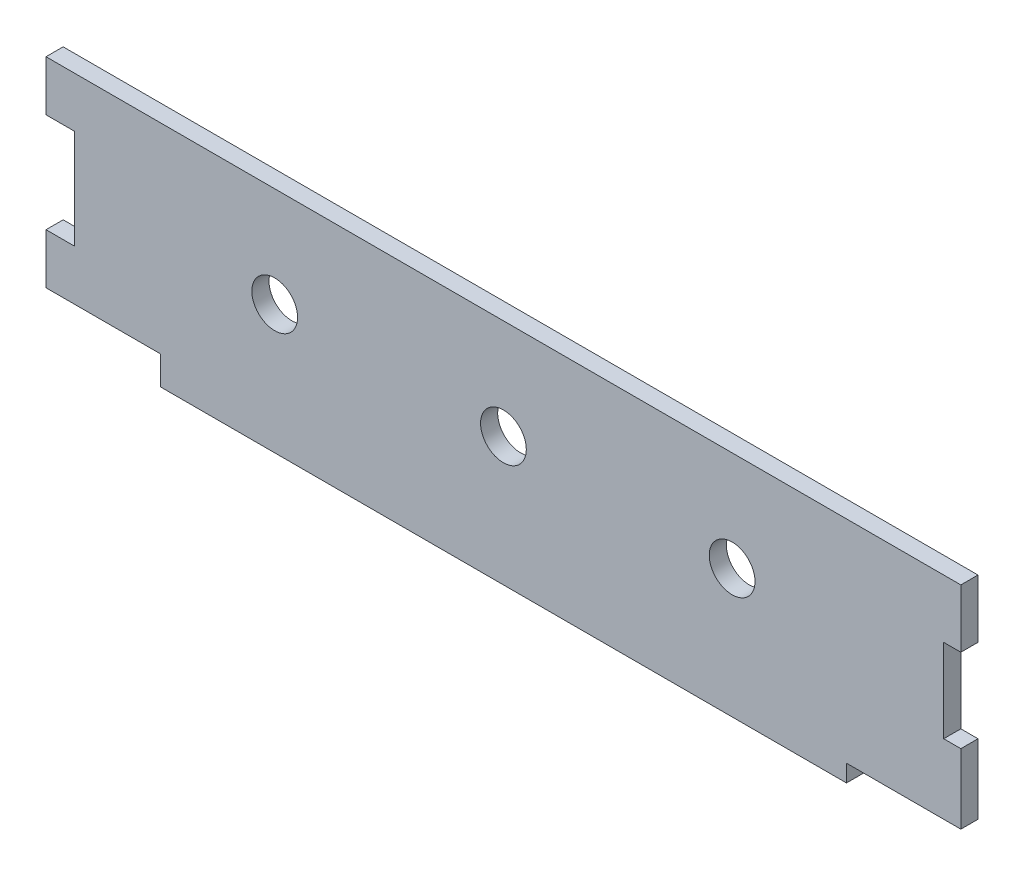
ISO-10303-21;
HEADER;
FILE_DESCRIPTION(('STEP AP214'),'2;1');
FILE_NAME('part.step','',(''),(''),'','','');
FILE_SCHEMA(('AUTOMOTIVE_DESIGN { 1 0 10303 214 1 1 1 1 }'));
ENDSEC;
DATA;
#1=APPLICATION_CONTEXT('core data for automotive mechanical design processes');
#2=APPLICATION_PROTOCOL_DEFINITION('international standard','automotive_design',2000,#1);
#3=PRODUCT_CONTEXT('',#1,'mechanical');
#4=PRODUCT('Part','Part','',(#3));
#5=PRODUCT_RELATED_PRODUCT_CATEGORY('part','',(#4));
#6=PRODUCT_DEFINITION_FORMATION('','',#4);
#7=PRODUCT_DEFINITION_CONTEXT('part definition',#1,'design');
#8=PRODUCT_DEFINITION('design','',#6,#7);
#9=PRODUCT_DEFINITION_SHAPE('','',#8);
#10=(LENGTH_UNIT() NAMED_UNIT(*) SI_UNIT(.MILLI.,.METRE.));
#11=(NAMED_UNIT(*) PLANE_ANGLE_UNIT() SI_UNIT($,.RADIAN.));
#12=(NAMED_UNIT(*) SI_UNIT($,.STERADIAN.) SOLID_ANGLE_UNIT());
#13=UNCERTAINTY_MEASURE_WITH_UNIT(LENGTH_MEASURE(1.E-05),#10,'distance_accuracy_value','');
#14=(GEOMETRIC_REPRESENTATION_CONTEXT(3) GLOBAL_UNCERTAINTY_ASSIGNED_CONTEXT((#13)) GLOBAL_UNIT_ASSIGNED_CONTEXT((#10,
#11,#12)) REPRESENTATION_CONTEXT('',''));
#15=CARTESIAN_POINT('',(0.,0.,0.));
#16=DIRECTION('',(0.,0.,1.));
#17=DIRECTION('',(1.,0.,0.));
#18=AXIS2_PLACEMENT_3D('',#15,#16,#17);
#19=CARTESIAN_POINT('',(0.,0.,1.5));
#20=DIRECTION('',(0.,0.,-1.));
#21=DIRECTION('',(-1.,0.,0.));
#22=AXIS2_PLACEMENT_3D('',#19,#20,#21);
#23=PLANE('',#22);
#24=DIRECTION('',(0.,-1.,0.));
#25=VECTOR('',#24,1.);
#26=CARTESIAN_POINT('',(-40.,4.34999999999999,1.5));
#27=LINE('',#26,#25);
#28=CARTESIAN_POINT('',(-40.0000000000001,8.74999999999999,1.5));
#29=VERTEX_POINT('',#28);
#30=CARTESIAN_POINT('',(-40.,4.34999999999999,1.5));
#31=VERTEX_POINT('',#30);
#32=EDGE_CURVE('E209',#29,#31,#27,.T.);
#33=ORIENTED_EDGE('',*,*,#32,.T.);
#34=DIRECTION('',(1.,0.,0.));
#35=VECTOR('',#34,1.);
#36=CARTESIAN_POINT('',(-37.5,4.34999999999999,1.5));
#37=LINE('',#36,#35);
#38=CARTESIAN_POINT('',(-37.5,4.34999999999999,1.5));
#39=VERTEX_POINT('',#38);
#40=EDGE_CURVE('E117',#31,#39,#37,.T.);
#41=ORIENTED_EDGE('',*,*,#40,.T.);
#42=DIRECTION('',(0.,-1.,0.));
#43=VECTOR('',#42,1.);
#44=CARTESIAN_POINT('',(-37.5,-4.35,1.5));
#45=LINE('',#44,#43);
#46=CARTESIAN_POINT('',(-37.5,-4.35,1.5));
#47=VERTEX_POINT('',#46);
#48=EDGE_CURVE('E248',#39,#47,#45,.T.);
#49=ORIENTED_EDGE('',*,*,#48,.T.);
#50=DIRECTION('',(-1.,0.,0.));
#51=VECTOR('',#50,1.);
#52=CARTESIAN_POINT('',(-40.,-4.35,1.5));
#53=LINE('',#52,#51);
#54=CARTESIAN_POINT('',(-40.,-4.35,1.5));
#55=VERTEX_POINT('',#54);
#56=EDGE_CURVE('E267',#47,#55,#53,.T.);
#57=ORIENTED_EDGE('',*,*,#56,.T.);
#58=DIRECTION('',(0.,-1.,0.));
#59=VECTOR('',#58,1.);
#60=CARTESIAN_POINT('',(-40.,-8.75000000000001,1.5));
#61=LINE('',#60,#59);
#62=CARTESIAN_POINT('',(-40.,-8.75000000000001,1.5));
#63=VERTEX_POINT('',#62);
#64=EDGE_CURVE('E264',#55,#63,#61,.T.);
#65=ORIENTED_EDGE('',*,*,#64,.T.);
#66=DIRECTION('',(1.,0.,0.));
#67=VECTOR('',#66,1.);
#68=CARTESIAN_POINT('',(-30.,-8.75,1.5));
#69=LINE('',#68,#67);
#70=CARTESIAN_POINT('',(-30.,-8.75,1.5));
#71=VERTEX_POINT('',#70);
#72=EDGE_CURVE('E266',#63,#71,#69,.T.);
#73=ORIENTED_EDGE('',*,*,#72,.T.);
#74=DIRECTION('',(0.,-1.,0.));
#75=VECTOR('',#74,1.);
#76=CARTESIAN_POINT('',(-30.,-11.25,1.5));
#77=LINE('',#76,#75);
#78=CARTESIAN_POINT('',(-30.,-11.25,1.5));
#79=VERTEX_POINT('',#78);
#80=EDGE_CURVE('E269',#71,#79,#77,.T.);
#81=ORIENTED_EDGE('',*,*,#80,.T.);
#82=DIRECTION('',(1.,0.,0.));
#83=VECTOR('',#82,1.);
#84=CARTESIAN_POINT('',(30.,-11.25,1.5));
#85=LINE('',#84,#83);
#86=CARTESIAN_POINT('',(30.,-11.25,1.5));
#87=VERTEX_POINT('',#86);
#88=EDGE_CURVE('E275',#79,#87,#85,.T.);
#89=ORIENTED_EDGE('',*,*,#88,.T.);
#90=DIRECTION('',(0.,1.,0.));
#91=VECTOR('',#90,1.);
#92=CARTESIAN_POINT('',(30.,-9.74999999999999,1.5));
#93=LINE('',#92,#91);
#94=CARTESIAN_POINT('',(30.,-9.74999999999999,1.5));
#95=VERTEX_POINT('',#94);
#96=EDGE_CURVE('E277',#87,#95,#93,.T.);
#97=ORIENTED_EDGE('',*,*,#96,.T.);
#98=DIRECTION('',(1.,0.,0.));
#99=VECTOR('',#98,1.);
#100=CARTESIAN_POINT('',(40.,-9.74999999999999,1.5));
#101=LINE('',#100,#99);
#102=CARTESIAN_POINT('',(40.,-9.74999999999999,1.5));
#103=VERTEX_POINT('',#102);
#104=EDGE_CURVE('E279',#95,#103,#101,.T.);
#105=ORIENTED_EDGE('',*,*,#104,.T.);
#106=DIRECTION('',(0.,1.,0.));
#107=VECTOR('',#106,1.);
#108=CARTESIAN_POINT('',(40.,-3.65,1.5));
#109=LINE('',#108,#107);
#110=CARTESIAN_POINT('',(40.,-3.65,1.5));
#111=VERTEX_POINT('',#110);
#112=EDGE_CURVE('E281',#103,#111,#109,.T.);
#113=ORIENTED_EDGE('',*,*,#112,.T.);
#114=DIRECTION('',(-1.,0.,0.));
#115=VECTOR('',#114,1.);
#116=CARTESIAN_POINT('',(38.5,-3.65,1.5));
#117=LINE('',#116,#115);
#118=CARTESIAN_POINT('',(38.5,-3.65,1.5));
#119=VERTEX_POINT('',#118);
#120=EDGE_CURVE('E283',#111,#119,#117,.T.);
#121=ORIENTED_EDGE('',*,*,#120,.T.);
#122=DIRECTION('',(0.,1.,0.));
#123=VECTOR('',#122,1.);
#124=CARTESIAN_POINT('',(38.5,3.65,1.5));
#125=LINE('',#124,#123);
#126=CARTESIAN_POINT('',(38.5,3.65,1.5));
#127=VERTEX_POINT('',#126);
#128=EDGE_CURVE('E160',#119,#127,#125,.T.);
#129=ORIENTED_EDGE('',*,*,#128,.T.);
#130=DIRECTION('',(1.,0.,0.));
#131=VECTOR('',#130,1.);
#132=CARTESIAN_POINT('',(40.,3.65,1.5));
#133=LINE('',#132,#131);
#134=CARTESIAN_POINT('',(40.,3.65,1.5));
#135=VERTEX_POINT('',#134);
#136=EDGE_CURVE('E154',#127,#135,#133,.T.);
#137=ORIENTED_EDGE('',*,*,#136,.T.);
#138=DIRECTION('',(0.,1.,0.));
#139=VECTOR('',#138,1.);
#140=CARTESIAN_POINT('',(40.0000000000001,8.74999999999999,1.5));
#141=LINE('',#140,#139);
#142=CARTESIAN_POINT('',(40.0000000000001,8.74999999999999,1.5));
#143=VERTEX_POINT('',#142);
#144=EDGE_CURVE('E158',#135,#143,#141,.T.);
#145=ORIENTED_EDGE('',*,*,#144,.T.);
#146=DIRECTION('',(-1.,0.,0.));
#147=VECTOR('',#146,1.);
#148=CARTESIAN_POINT('',(-40.0000000000001,8.74999999999999,1.5));
#149=LINE('',#148,#147);
#150=EDGE_CURVE('E50',#143,#29,#149,.T.);
#151=ORIENTED_EDGE('',*,*,#150,.T.);
#152=EDGE_LOOP('',(#33,#41,#49,#57,#65,#73,#81,#89,#97,#105,#113,#121,#129,#137,#145,#151));
#153=FACE_BOUND('',#152,.T.);
#154=CARTESIAN_POINT('',(20.,0.,1.5));
#155=DIRECTION('',(0.,0.,1.));
#156=DIRECTION('',(1.,0.,0.));
#157=AXIS2_PLACEMENT_3D('',#154,#155,#156);
#158=CIRCLE('',#157,2.00000000000003);
#159=CARTESIAN_POINT('',(22.,0.,1.5));
#160=VERTEX_POINT('',#159);
#161=EDGE_CURVE('E182',#160,#160,#158,.T.);
#162=ORIENTED_EDGE('',*,*,#161,.F.);
#163=EDGE_LOOP('',(#162));
#164=FACE_BOUND('',#163,.T.);
#165=CARTESIAN_POINT('',(0.,0.,1.5));
#166=DIRECTION('',(0.,0.,1.));
#167=DIRECTION('',(1.,0.,0.));
#168=AXIS2_PLACEMENT_3D('',#165,#166,#167);
#169=CIRCLE('',#168,2.00000000000002);
#170=CARTESIAN_POINT('',(2.,0.,1.5));
#171=VERTEX_POINT('',#170);
#172=EDGE_CURVE('E337',#171,#171,#169,.T.);
#173=ORIENTED_EDGE('',*,*,#172,.F.);
#174=EDGE_LOOP('',(#173));
#175=FACE_BOUND('',#174,.T.);
#176=CARTESIAN_POINT('',(-20.,0.,1.5));
#177=DIRECTION('',(0.,0.,1.));
#178=DIRECTION('',(1.,0.,0.));
#179=AXIS2_PLACEMENT_3D('',#176,#177,#178);
#180=CIRCLE('',#179,2.00000000000003);
#181=CARTESIAN_POINT('',(-18.,0.,1.5));
#182=VERTEX_POINT('',#181);
#183=EDGE_CURVE('E328',#182,#182,#180,.T.);
#184=ORIENTED_EDGE('',*,*,#183,.F.);
#185=EDGE_LOOP('',(#184));
#186=FACE_BOUND('',#185,.T.);
#187=ADVANCED_FACE('F33',(#153,#164,#175,#186),#23,.F.);
#188=CARTESIAN_POINT('',(0.,0.,0.));
#189=DIRECTION('',(0.,0.,-1.));
#190=DIRECTION('',(-1.,0.,0.));
#191=AXIS2_PLACEMENT_3D('',#188,#189,#190);
#192=PLANE('',#191);
#193=CARTESIAN_POINT('',(0.,0.,0.));
#194=DIRECTION('',(0.,0.,1.));
#195=DIRECTION('',(1.,0.,0.));
#196=AXIS2_PLACEMENT_3D('',#193,#194,#195);
#197=CIRCLE('',#196,2.00000000000002);
#198=CARTESIAN_POINT('',(2.,0.,0.));
#199=VERTEX_POINT('',#198);
#200=EDGE_CURVE('E334',#199,#199,#197,.T.);
#201=ORIENTED_EDGE('',*,*,#200,.T.);
#202=EDGE_LOOP('',(#201));
#203=FACE_BOUND('',#202,.T.);
#204=DIRECTION('',(0.,-1.,0.));
#205=VECTOR('',#204,1.);
#206=CARTESIAN_POINT('',(-40.,4.34999999999999,0.));
#207=LINE('',#206,#205);
#208=CARTESIAN_POINT('',(-40.0000000000001,8.74999999999999,0.));
#209=VERTEX_POINT('',#208);
#210=CARTESIAN_POINT('',(-40.,4.34999999999999,0.));
#211=VERTEX_POINT('',#210);
#212=EDGE_CURVE('E178',#209,#211,#207,.T.);
#213=ORIENTED_EDGE('',*,*,#212,.F.);
#214=DIRECTION('',(-1.,0.,0.));
#215=VECTOR('',#214,1.);
#216=CARTESIAN_POINT('',(-40.0000000000001,8.74999999999999,0.));
#217=LINE('',#216,#215);
#218=CARTESIAN_POINT('',(40.0000000000001,8.74999999999999,0.));
#219=VERTEX_POINT('',#218);
#220=EDGE_CURVE('E109',#219,#209,#217,.T.);
#221=ORIENTED_EDGE('',*,*,#220,.F.);
#222=DIRECTION('',(0.,1.,0.));
#223=VECTOR('',#222,1.);
#224=CARTESIAN_POINT('',(40.0000000000001,8.74999999999999,0.));
#225=LINE('',#224,#223);
#226=CARTESIAN_POINT('',(40.,3.65,0.));
#227=VERTEX_POINT('',#226);
#228=EDGE_CURVE('E103',#227,#219,#225,.T.);
#229=ORIENTED_EDGE('',*,*,#228,.F.);
#230=DIRECTION('',(1.,0.,0.));
#231=VECTOR('',#230,1.);
#232=CARTESIAN_POINT('',(40.,3.65,0.));
#233=LINE('',#232,#231);
#234=CARTESIAN_POINT('',(38.5,3.65,0.));
#235=VERTEX_POINT('',#234);
#236=EDGE_CURVE('E168',#235,#227,#233,.T.);
#237=ORIENTED_EDGE('',*,*,#236,.F.);
#238=DIRECTION('',(0.,1.,0.));
#239=VECTOR('',#238,1.);
#240=CARTESIAN_POINT('',(38.5,3.65,0.));
#241=LINE('',#240,#239);
#242=CARTESIAN_POINT('',(38.5,-3.65,0.));
#243=VERTEX_POINT('',#242);
#244=EDGE_CURVE('E204',#243,#235,#241,.T.);
#245=ORIENTED_EDGE('',*,*,#244,.F.);
#246=DIRECTION('',(-1.,0.,0.));
#247=VECTOR('',#246,1.);
#248=CARTESIAN_POINT('',(38.5,-3.65,0.));
#249=LINE('',#248,#247);
#250=CARTESIAN_POINT('',(40.,-3.65,0.));
#251=VERTEX_POINT('',#250);
#252=EDGE_CURVE('E202',#251,#243,#249,.T.);
#253=ORIENTED_EDGE('',*,*,#252,.F.);
#254=DIRECTION('',(0.,1.,0.));
#255=VECTOR('',#254,1.);
#256=CARTESIAN_POINT('',(40.,-3.65,0.));
#257=LINE('',#256,#255);
#258=CARTESIAN_POINT('',(40.,-9.74999999999999,0.));
#259=VERTEX_POINT('',#258);
#260=EDGE_CURVE('E200',#259,#251,#257,.T.);
#261=ORIENTED_EDGE('',*,*,#260,.F.);
#262=DIRECTION('',(1.,0.,0.));
#263=VECTOR('',#262,1.);
#264=CARTESIAN_POINT('',(40.,-9.74999999999999,0.));
#265=LINE('',#264,#263);
#266=CARTESIAN_POINT('',(30.,-9.74999999999999,0.));
#267=VERTEX_POINT('',#266);
#268=EDGE_CURVE('E198',#267,#259,#265,.T.);
#269=ORIENTED_EDGE('',*,*,#268,.F.);
#270=DIRECTION('',(0.,1.,0.));
#271=VECTOR('',#270,1.);
#272=CARTESIAN_POINT('',(30.,-9.74999999999999,0.));
#273=LINE('',#272,#271);
#274=CARTESIAN_POINT('',(30.,-11.25,0.));
#275=VERTEX_POINT('',#274);
#276=EDGE_CURVE('E196',#275,#267,#273,.T.);
#277=ORIENTED_EDGE('',*,*,#276,.F.);
#278=DIRECTION('',(1.,0.,0.));
#279=VECTOR('',#278,1.);
#280=CARTESIAN_POINT('',(30.,-11.25,0.));
#281=LINE('',#280,#279);
#282=CARTESIAN_POINT('',(-30.,-11.25,0.));
#283=VERTEX_POINT('',#282);
#284=EDGE_CURVE('E194',#283,#275,#281,.T.);
#285=ORIENTED_EDGE('',*,*,#284,.F.);
#286=DIRECTION('',(0.,-1.,0.));
#287=VECTOR('',#286,1.);
#288=CARTESIAN_POINT('',(-30.,-11.25,0.));
#289=LINE('',#288,#287);
#290=CARTESIAN_POINT('',(-30.,-8.75,0.));
#291=VERTEX_POINT('',#290);
#292=EDGE_CURVE('E192',#291,#283,#289,.T.);
#293=ORIENTED_EDGE('',*,*,#292,.F.);
#294=DIRECTION('',(1.,0.,0.));
#295=VECTOR('',#294,1.);
#296=CARTESIAN_POINT('',(-30.,-8.75,0.));
#297=LINE('',#296,#295);
#298=CARTESIAN_POINT('',(-40.,-8.75000000000001,0.));
#299=VERTEX_POINT('',#298);
#300=EDGE_CURVE('E190',#299,#291,#297,.T.);
#301=ORIENTED_EDGE('',*,*,#300,.F.);
#302=DIRECTION('',(0.,-1.,0.));
#303=VECTOR('',#302,1.);
#304=CARTESIAN_POINT('',(-40.,-8.75000000000001,0.));
#305=LINE('',#304,#303);
#306=CARTESIAN_POINT('',(-40.,-4.35,0.));
#307=VERTEX_POINT('',#306);
#308=EDGE_CURVE('E188',#307,#299,#305,.T.);
#309=ORIENTED_EDGE('',*,*,#308,.F.);
#310=DIRECTION('',(-1.,0.,0.));
#311=VECTOR('',#310,1.);
#312=CARTESIAN_POINT('',(-40.,-4.35,0.));
#313=LINE('',#312,#311);
#314=CARTESIAN_POINT('',(-37.5,-4.35,0.));
#315=VERTEX_POINT('',#314);
#316=EDGE_CURVE('E186',#315,#307,#313,.T.);
#317=ORIENTED_EDGE('',*,*,#316,.F.);
#318=DIRECTION('',(0.,-1.,0.));
#319=VECTOR('',#318,1.);
#320=CARTESIAN_POINT('',(-37.5,-4.35,0.));
#321=LINE('',#320,#319);
#322=CARTESIAN_POINT('',(-37.5,4.34999999999999,0.));
#323=VERTEX_POINT('',#322);
#324=EDGE_CURVE('E184',#323,#315,#321,.T.);
#325=ORIENTED_EDGE('',*,*,#324,.F.);
#326=DIRECTION('',(1.,0.,0.));
#327=VECTOR('',#326,1.);
#328=CARTESIAN_POINT('',(-37.5,4.34999999999999,0.));
#329=LINE('',#328,#327);
#330=EDGE_CURVE('E181',#211,#323,#329,.T.);
#331=ORIENTED_EDGE('',*,*,#330,.F.);
#332=EDGE_LOOP('',(#213,#221,#229,#237,#245,#253,#261,#269,#277,#285,#293,#301,#309,#317,#325,#331));
#333=FACE_BOUND('',#332,.T.);
#334=CARTESIAN_POINT('',(20.,0.,0.));
#335=DIRECTION('',(0.,0.,1.));
#336=DIRECTION('',(1.,0.,0.));
#337=AXIS2_PLACEMENT_3D('',#334,#335,#336);
#338=CIRCLE('',#337,2.00000000000003);
#339=CARTESIAN_POINT('',(22.,0.,0.));
#340=VERTEX_POINT('',#339);
#341=EDGE_CURVE('E340',#340,#340,#338,.T.);
#342=ORIENTED_EDGE('',*,*,#341,.T.);
#343=EDGE_LOOP('',(#342));
#344=FACE_BOUND('',#343,.T.);
#345=CARTESIAN_POINT('',(-20.,0.,0.));
#346=DIRECTION('',(0.,0.,1.));
#347=DIRECTION('',(1.,0.,0.));
#348=AXIS2_PLACEMENT_3D('',#345,#346,#347);
#349=CIRCLE('',#348,2.00000000000003);
#350=CARTESIAN_POINT('',(-18.,0.,0.));
#351=VERTEX_POINT('',#350);
#352=EDGE_CURVE('E331',#351,#351,#349,.T.);
#353=ORIENTED_EDGE('',*,*,#352,.T.);
#354=EDGE_LOOP('',(#353));
#355=FACE_BOUND('',#354,.T.);
#356=ADVANCED_FACE('F252',(#203,#333,#344,#355),#192,.T.);
#357=CARTESIAN_POINT('',(-40.,4.34999999999999,1.5));
#358=DIRECTION('',(1.,0.,0.));
#359=DIRECTION('',(0.,1.,0.));
#360=AXIS2_PLACEMENT_3D('',#357,#358,#359);
#361=PLANE('',#360);
#362=ORIENTED_EDGE('',*,*,#212,.T.);
#363=DIRECTION('',(0.,0.,-1.));
#364=VECTOR('',#363,1.);
#365=CARTESIAN_POINT('',(-40.,4.34999999999999,1.5));
#366=LINE('',#365,#364);
#367=EDGE_CURVE('E11',#31,#211,#366,.T.);
#368=ORIENTED_EDGE('',*,*,#367,.F.);
#369=ORIENTED_EDGE('',*,*,#32,.F.);
#370=DIRECTION('',(0.,0.,-1.));
#371=VECTOR('',#370,1.);
#372=CARTESIAN_POINT('',(-40.0000000000001,8.74999999999999,1.5));
#373=LINE('',#372,#371);
#374=EDGE_CURVE('E174',#29,#209,#373,.T.);
#375=ORIENTED_EDGE('',*,*,#374,.T.);
#376=EDGE_LOOP('',(#362,#368,#369,#375));
#377=FACE_BOUND('',#376,.T.);
#378=ADVANCED_FACE('F35',(#377),#361,.F.);
#379=CARTESIAN_POINT('',(-37.5,4.34999999999999,1.5));
#380=DIRECTION('',(0.,1.,0.));
#381=DIRECTION('',(-1.,0.,0.));
#382=AXIS2_PLACEMENT_3D('',#379,#380,#381);
#383=PLANE('',#382);
#384=ORIENTED_EDGE('',*,*,#330,.T.);
#385=DIRECTION('',(0.,0.,-1.));
#386=VECTOR('',#385,1.);
#387=CARTESIAN_POINT('',(-37.5,4.34999999999999,1.5));
#388=LINE('',#387,#386);
#389=EDGE_CURVE('E42',#39,#323,#388,.T.);
#390=ORIENTED_EDGE('',*,*,#389,.F.);
#391=ORIENTED_EDGE('',*,*,#40,.F.);
#392=ORIENTED_EDGE('',*,*,#367,.T.);
#393=EDGE_LOOP('',(#384,#390,#391,#392));
#394=FACE_BOUND('',#393,.T.);
#395=ADVANCED_FACE('F483',(#394),#383,.F.);
#396=CARTESIAN_POINT('',(-37.5,-4.35,1.5));
#397=DIRECTION('',(1.,0.,0.));
#398=DIRECTION('',(0.,1.,0.));
#399=AXIS2_PLACEMENT_3D('',#396,#397,#398);
#400=PLANE('',#399);
#401=ORIENTED_EDGE('',*,*,#324,.T.);
#402=DIRECTION('',(0.,0.,-1.));
#403=VECTOR('',#402,1.);
#404=CARTESIAN_POINT('',(-37.5,-4.35,1.5));
#405=LINE('',#404,#403);
#406=EDGE_CURVE('E240',#47,#315,#405,.T.);
#407=ORIENTED_EDGE('',*,*,#406,.F.);
#408=ORIENTED_EDGE('',*,*,#48,.F.);
#409=ORIENTED_EDGE('',*,*,#389,.T.);
#410=EDGE_LOOP('',(#401,#407,#408,#409));
#411=FACE_BOUND('',#410,.T.);
#412=ADVANCED_FACE('F246',(#411),#400,.F.);
#413=CARTESIAN_POINT('',(-40.,-4.35,1.5));
#414=DIRECTION('',(0.,-1.,0.));
#415=DIRECTION('',(0.,0.,-1.));
#416=AXIS2_PLACEMENT_3D('',#413,#414,#415);
#417=PLANE('',#416);
#418=ORIENTED_EDGE('',*,*,#316,.T.);
#419=DIRECTION('',(0.,0.,-1.));
#420=VECTOR('',#419,1.);
#421=CARTESIAN_POINT('',(-40.,-4.35,1.5));
#422=LINE('',#421,#420);
#423=EDGE_CURVE('E237',#55,#307,#422,.T.);
#424=ORIENTED_EDGE('',*,*,#423,.F.);
#425=ORIENTED_EDGE('',*,*,#56,.F.);
#426=ORIENTED_EDGE('',*,*,#406,.T.);
#427=EDGE_LOOP('',(#418,#424,#425,#426));
#428=FACE_BOUND('',#427,.T.);
#429=ADVANCED_FACE('F258',(#428),#417,.F.);
#430=CARTESIAN_POINT('',(-40.,-8.75000000000001,1.5));
#431=DIRECTION('',(1.,0.,0.));
#432=DIRECTION('',(0.,1.,0.));
#433=AXIS2_PLACEMENT_3D('',#430,#431,#432);
#434=PLANE('',#433);
#435=ORIENTED_EDGE('',*,*,#308,.T.);
#436=DIRECTION('',(0.,0.,-1.));
#437=VECTOR('',#436,1.);
#438=CARTESIAN_POINT('',(-40.,-8.75000000000001,1.5));
#439=LINE('',#438,#437);
#440=EDGE_CURVE('E234',#63,#299,#439,.T.);
#441=ORIENTED_EDGE('',*,*,#440,.F.);
#442=ORIENTED_EDGE('',*,*,#64,.F.);
#443=ORIENTED_EDGE('',*,*,#423,.T.);
#444=EDGE_LOOP('',(#435,#441,#442,#443));
#445=FACE_BOUND('',#444,.T.);
#446=ADVANCED_FACE('F262',(#445),#434,.F.);
#447=CARTESIAN_POINT('',(-30.,-8.75,1.5));
#448=DIRECTION('',(0.,1.,0.));
#449=DIRECTION('',(-1.,0.,0.));
#450=AXIS2_PLACEMENT_3D('',#447,#448,#449);
#451=PLANE('',#450);
#452=ORIENTED_EDGE('',*,*,#300,.T.);
#453=DIRECTION('',(0.,0.,-1.));
#454=VECTOR('',#453,1.);
#455=CARTESIAN_POINT('',(-30.,-8.75,1.5));
#456=LINE('',#455,#454);
#457=EDGE_CURVE('E231',#71,#291,#456,.T.);
#458=ORIENTED_EDGE('',*,*,#457,.F.);
#459=ORIENTED_EDGE('',*,*,#72,.F.);
#460=ORIENTED_EDGE('',*,*,#440,.T.);
#461=EDGE_LOOP('',(#452,#458,#459,#460));
#462=FACE_BOUND('',#461,.T.);
#463=ADVANCED_FACE('F448',(#462),#451,.F.);
#464=CARTESIAN_POINT('',(-30.,-11.25,1.5));
#465=DIRECTION('',(1.,0.,0.));
#466=DIRECTION('',(0.,1.,0.));
#467=AXIS2_PLACEMENT_3D('',#464,#465,#466);
#468=PLANE('',#467);
#469=ORIENTED_EDGE('',*,*,#292,.T.);
#470=DIRECTION('',(0.,0.,-1.));
#471=VECTOR('',#470,1.);
#472=CARTESIAN_POINT('',(-30.,-11.25,1.5));
#473=LINE('',#472,#471);
#474=EDGE_CURVE('E228',#79,#283,#473,.T.);
#475=ORIENTED_EDGE('',*,*,#474,.F.);
#476=ORIENTED_EDGE('',*,*,#80,.F.);
#477=ORIENTED_EDGE('',*,*,#457,.T.);
#478=EDGE_LOOP('',(#469,#475,#476,#477));
#479=FACE_BOUND('',#478,.T.);
#480=ADVANCED_FACE('F438',(#479),#468,.F.);
#481=CARTESIAN_POINT('',(30.,-11.25,1.5));
#482=DIRECTION('',(0.,1.,0.));
#483=DIRECTION('',(-1.,0.,0.));
#484=AXIS2_PLACEMENT_3D('',#481,#482,#483);
#485=PLANE('',#484);
#486=ORIENTED_EDGE('',*,*,#284,.T.);
#487=DIRECTION('',(0.,0.,-1.));
#488=VECTOR('',#487,1.);
#489=CARTESIAN_POINT('',(30.,-11.25,1.5));
#490=LINE('',#489,#488);
#491=EDGE_CURVE('E225',#87,#275,#490,.T.);
#492=ORIENTED_EDGE('',*,*,#491,.F.);
#493=ORIENTED_EDGE('',*,*,#88,.F.);
#494=ORIENTED_EDGE('',*,*,#474,.T.);
#495=EDGE_LOOP('',(#486,#492,#493,#494));
#496=FACE_BOUND('',#495,.T.);
#497=ADVANCED_FACE('F428',(#496),#485,.F.);
#498=CARTESIAN_POINT('',(30.,-9.74999999999999,1.5));
#499=DIRECTION('',(-1.,0.,0.));
#500=DIRECTION('',(0.,0.,1.));
#501=AXIS2_PLACEMENT_3D('',#498,#499,#500);
#502=PLANE('',#501);
#503=ORIENTED_EDGE('',*,*,#276,.T.);
#504=DIRECTION('',(0.,0.,-1.));
#505=VECTOR('',#504,1.);
#506=CARTESIAN_POINT('',(30.,-9.74999999999999,1.5));
#507=LINE('',#506,#505);
#508=EDGE_CURVE('E222',#95,#267,#507,.T.);
#509=ORIENTED_EDGE('',*,*,#508,.F.);
#510=ORIENTED_EDGE('',*,*,#96,.F.);
#511=ORIENTED_EDGE('',*,*,#491,.T.);
#512=EDGE_LOOP('',(#503,#509,#510,#511));
#513=FACE_BOUND('',#512,.T.);
#514=ADVANCED_FACE('F418',(#513),#502,.F.);
#515=CARTESIAN_POINT('',(40.,-9.74999999999999,1.5));
#516=DIRECTION('',(0.,1.,0.));
#517=DIRECTION('',(-1.,0.,0.));
#518=AXIS2_PLACEMENT_3D('',#515,#516,#517);
#519=PLANE('',#518);
#520=ORIENTED_EDGE('',*,*,#268,.T.);
#521=DIRECTION('',(0.,0.,-1.));
#522=VECTOR('',#521,1.);
#523=CARTESIAN_POINT('',(40.,-9.74999999999999,1.5));
#524=LINE('',#523,#522);
#525=EDGE_CURVE('E219',#103,#259,#524,.T.);
#526=ORIENTED_EDGE('',*,*,#525,.F.);
#527=ORIENTED_EDGE('',*,*,#104,.F.);
#528=ORIENTED_EDGE('',*,*,#508,.T.);
#529=EDGE_LOOP('',(#520,#526,#527,#528));
#530=FACE_BOUND('',#529,.T.);
#531=ADVANCED_FACE('F408',(#530),#519,.F.);
#532=CARTESIAN_POINT('',(40.,-3.65,1.5));
#533=DIRECTION('',(-1.,0.,0.));
#534=DIRECTION('',(0.,0.,1.));
#535=AXIS2_PLACEMENT_3D('',#532,#533,#534);
#536=PLANE('',#535);
#537=ORIENTED_EDGE('',*,*,#260,.T.);
#538=DIRECTION('',(0.,0.,-1.));
#539=VECTOR('',#538,1.);
#540=CARTESIAN_POINT('',(40.,-3.65,1.5));
#541=LINE('',#540,#539);
#542=EDGE_CURVE('E216',#111,#251,#541,.T.);
#543=ORIENTED_EDGE('',*,*,#542,.F.);
#544=ORIENTED_EDGE('',*,*,#112,.F.);
#545=ORIENTED_EDGE('',*,*,#525,.T.);
#546=EDGE_LOOP('',(#537,#543,#544,#545));
#547=FACE_BOUND('',#546,.T.);
#548=ADVANCED_FACE('F399',(#547),#536,.F.);
#549=CARTESIAN_POINT('',(38.5,-3.65,1.5));
#550=DIRECTION('',(0.,-1.,0.));
#551=DIRECTION('',(1.,0.,0.));
#552=AXIS2_PLACEMENT_3D('',#549,#550,#551);
#553=PLANE('',#552);
#554=ORIENTED_EDGE('',*,*,#252,.T.);
#555=DIRECTION('',(0.,0.,-1.));
#556=VECTOR('',#555,1.);
#557=CARTESIAN_POINT('',(38.5,-3.65,1.5));
#558=LINE('',#557,#556);
#559=EDGE_CURVE('E213',#119,#243,#558,.T.);
#560=ORIENTED_EDGE('',*,*,#559,.F.);
#561=ORIENTED_EDGE('',*,*,#120,.F.);
#562=ORIENTED_EDGE('',*,*,#542,.T.);
#563=EDGE_LOOP('',(#554,#560,#561,#562));
#564=FACE_BOUND('',#563,.T.);
#565=ADVANCED_FACE('F289',(#564),#553,.F.);
#566=CARTESIAN_POINT('',(38.5,3.65,1.5));
#567=DIRECTION('',(-1.,0.,0.));
#568=DIRECTION('',(0.,0.,1.));
#569=AXIS2_PLACEMENT_3D('',#566,#567,#568);
#570=PLANE('',#569);
#571=ORIENTED_EDGE('',*,*,#244,.T.);
#572=DIRECTION('',(0.,0.,-1.));
#573=VECTOR('',#572,1.);
#574=CARTESIAN_POINT('',(38.5,3.65,1.5));
#575=LINE('',#574,#573);
#576=EDGE_CURVE('E169',#127,#235,#575,.T.);
#577=ORIENTED_EDGE('',*,*,#576,.F.);
#578=ORIENTED_EDGE('',*,*,#128,.F.);
#579=ORIENTED_EDGE('',*,*,#559,.T.);
#580=EDGE_LOOP('',(#571,#577,#578,#579));
#581=FACE_BOUND('',#580,.T.);
#582=ADVANCED_FACE('F293',(#581),#570,.F.);
#583=CARTESIAN_POINT('',(40.,3.65,1.5));
#584=DIRECTION('',(0.,1.,0.));
#585=DIRECTION('',(-1.,0.,0.));
#586=AXIS2_PLACEMENT_3D('',#583,#584,#585);
#587=PLANE('',#586);
#588=ORIENTED_EDGE('',*,*,#236,.T.);
#589=DIRECTION('',(0.,0.,-1.));
#590=VECTOR('',#589,1.);
#591=CARTESIAN_POINT('',(40.,3.65,1.5));
#592=LINE('',#591,#590);
#593=EDGE_CURVE('E165',#135,#227,#592,.T.);
#594=ORIENTED_EDGE('',*,*,#593,.F.);
#595=ORIENTED_EDGE('',*,*,#136,.F.);
#596=ORIENTED_EDGE('',*,*,#576,.T.);
#597=EDGE_LOOP('',(#588,#594,#595,#596));
#598=FACE_BOUND('',#597,.T.);
#599=ADVANCED_FACE('F166',(#598),#587,.F.);
#600=CARTESIAN_POINT('',(40.0000000000001,8.74999999999999,1.5));
#601=DIRECTION('',(-1.,0.,0.));
#602=DIRECTION('',(0.,-1.,0.));
#603=AXIS2_PLACEMENT_3D('',#600,#601,#602);
#604=PLANE('',#603);
#605=ORIENTED_EDGE('',*,*,#228,.T.);
#606=DIRECTION('',(0.,0.,-1.));
#607=VECTOR('',#606,1.);
#608=CARTESIAN_POINT('',(40.0000000000001,8.74999999999999,1.5));
#609=LINE('',#608,#607);
#610=EDGE_CURVE('E170',#143,#219,#609,.T.);
#611=ORIENTED_EDGE('',*,*,#610,.F.);
#612=ORIENTED_EDGE('',*,*,#144,.F.);
#613=ORIENTED_EDGE('',*,*,#593,.T.);
#614=EDGE_LOOP('',(#605,#611,#612,#613));
#615=FACE_BOUND('',#614,.T.);
#616=ADVANCED_FACE('F172',(#615),#604,.F.);
#617=CARTESIAN_POINT('',(-40.0000000000001,8.74999999999999,1.5));
#618=DIRECTION('',(0.,-1.,0.));
#619=DIRECTION('',(0.,0.,-1.));
#620=AXIS2_PLACEMENT_3D('',#617,#618,#619);
#621=PLANE('',#620);
#622=ORIENTED_EDGE('',*,*,#220,.T.);
#623=ORIENTED_EDGE('',*,*,#374,.F.);
#624=ORIENTED_EDGE('',*,*,#150,.F.);
#625=ORIENTED_EDGE('',*,*,#610,.T.);
#626=EDGE_LOOP('',(#622,#623,#624,#625));
#627=FACE_BOUND('',#626,.T.);
#628=ADVANCED_FACE('F297',(#627),#621,.F.);
#629=CARTESIAN_POINT('',(20.,0.,1.5));
#630=DIRECTION('',(0.,0.,-1.));
#631=DIRECTION('',(-1.,0.,0.));
#632=AXIS2_PLACEMENT_3D('',#629,#630,#631);
#633=CYLINDRICAL_SURFACE('',#632,2.00000000000003);
#634=ORIENTED_EDGE('',*,*,#161,.T.);
#635=EDGE_LOOP('',(#634));
#636=FACE_BOUND('',#635,.T.);
#637=ORIENTED_EDGE('',*,*,#341,.F.);
#638=EDGE_LOOP('',(#637));
#639=FACE_BOUND('',#638,.T.);
#640=ADVANCED_FACE('F299',(#636,#639),#633,.F.);
#641=CARTESIAN_POINT('',(0.,0.,1.5));
#642=DIRECTION('',(0.,0.,-1.));
#643=DIRECTION('',(-1.,0.,0.));
#644=AXIS2_PLACEMENT_3D('',#641,#642,#643);
#645=CYLINDRICAL_SURFACE('',#644,2.00000000000002);
#646=ORIENTED_EDGE('',*,*,#172,.T.);
#647=EDGE_LOOP('',(#646));
#648=FACE_BOUND('',#647,.T.);
#649=ORIENTED_EDGE('',*,*,#200,.F.);
#650=EDGE_LOOP('',(#649));
#651=FACE_BOUND('',#650,.T.);
#652=ADVANCED_FACE('F305',(#648,#651),#645,.F.);
#653=CARTESIAN_POINT('',(-20.,0.,1.5));
#654=DIRECTION('',(0.,0.,-1.));
#655=DIRECTION('',(-1.,0.,0.));
#656=AXIS2_PLACEMENT_3D('',#653,#654,#655);
#657=CYLINDRICAL_SURFACE('',#656,2.00000000000003);
#658=ORIENTED_EDGE('',*,*,#183,.T.);
#659=EDGE_LOOP('',(#658));
#660=FACE_BOUND('',#659,.T.);
#661=ORIENTED_EDGE('',*,*,#352,.F.);
#662=EDGE_LOOP('',(#661));
#663=FACE_BOUND('',#662,.T.);
#664=ADVANCED_FACE('F319',(#660,#663),#657,.F.);
#665=CLOSED_SHELL('',(#187,#356,#378,#395,#412,#429,#446,#463,#480,#497,#514,#531,#548,#565,
#582,#599,#616,#628,#640,#652,#664));
#666=MANIFOLD_SOLID_BREP('B2',#665);
#667=ADVANCED_BREP_SHAPE_REPRESENTATION('',(#18,#666),#14);
#668=SHAPE_DEFINITION_REPRESENTATION(#9,#667);
ENDSEC;
END-ISO-10303-21;
